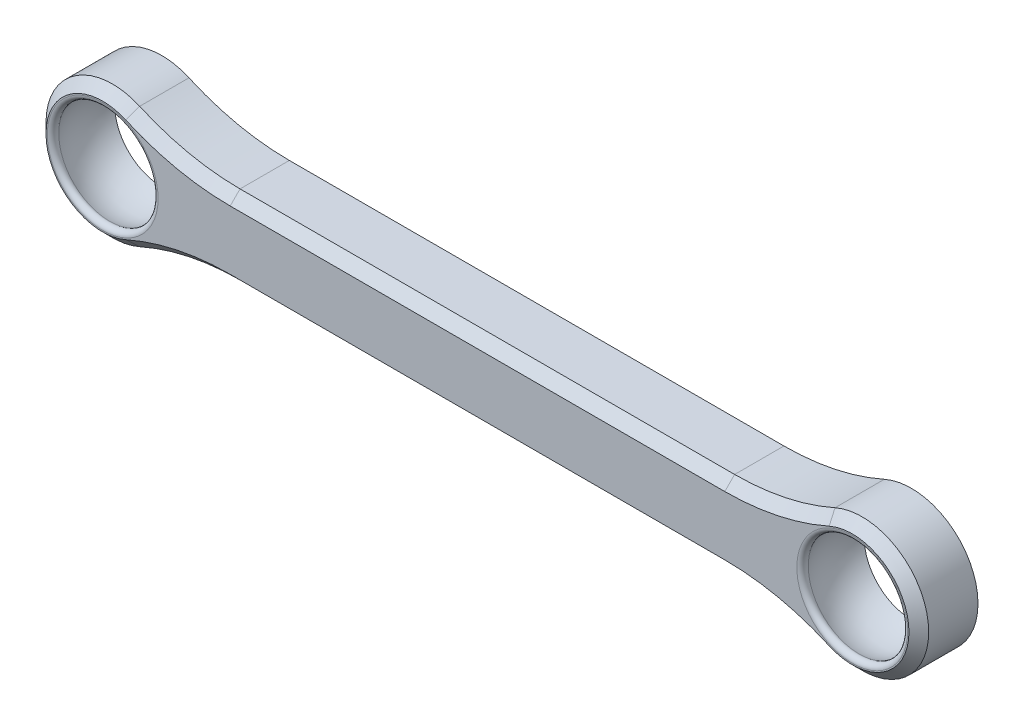
ISO-10303-21;
HEADER;
FILE_DESCRIPTION(('STEP AP214'),'2;1');
FILE_NAME('part.step','',(''),(''),'','','');
FILE_SCHEMA(('AUTOMOTIVE_DESIGN { 1 0 10303 214 1 1 1 1 }'));
ENDSEC;
DATA;
#1=APPLICATION_CONTEXT('core data for automotive mechanical design processes');
#2=APPLICATION_PROTOCOL_DEFINITION('international standard','automotive_design',2000,#1);
#3=PRODUCT_CONTEXT('',#1,'mechanical');
#4=PRODUCT('Part','Part','',(#3));
#5=PRODUCT_RELATED_PRODUCT_CATEGORY('part','',(#4));
#6=PRODUCT_DEFINITION_FORMATION('','',#4);
#7=PRODUCT_DEFINITION_CONTEXT('part definition',#1,'design');
#8=PRODUCT_DEFINITION('design','',#6,#7);
#9=PRODUCT_DEFINITION_SHAPE('','',#8);
#10=(LENGTH_UNIT() NAMED_UNIT(*) SI_UNIT(.MILLI.,.METRE.));
#11=(NAMED_UNIT(*) PLANE_ANGLE_UNIT() SI_UNIT($,.RADIAN.));
#12=(NAMED_UNIT(*) SI_UNIT($,.STERADIAN.) SOLID_ANGLE_UNIT());
#13=UNCERTAINTY_MEASURE_WITH_UNIT(LENGTH_MEASURE(1.E-05),#10,'distance_accuracy_value','');
#14=(GEOMETRIC_REPRESENTATION_CONTEXT(3) GLOBAL_UNCERTAINTY_ASSIGNED_CONTEXT((#13)) GLOBAL_UNIT_ASSIGNED_CONTEXT((#10,
#11,#12)) REPRESENTATION_CONTEXT('',''));
#15=CARTESIAN_POINT('',(0.,0.,0.));
#16=DIRECTION('',(0.,0.,1.));
#17=DIRECTION('',(1.,0.,0.));
#18=AXIS2_PLACEMENT_3D('',#15,#16,#17);
#19=CARTESIAN_POINT('',(8.,0.,6.));
#20=DIRECTION('',(0.,0.,-1.));
#21=DIRECTION('',(-1.,0.,0.));
#22=AXIS2_PLACEMENT_3D('',#19,#20,#21);
#23=CYLINDRICAL_SURFACE('',#22,6.75);
#24=DIRECTION('',(0.,0.,-1.));
#25=VECTOR('',#24,1.);
#26=CARTESIAN_POINT('',(10.7478911872219,-6.16535433070866,6.));
#27=LINE('',#26,#25);
#28=CARTESIAN_POINT('',(10.7478911872219,-6.16535433070866,0.));
#29=VERTEX_POINT('',#28);
#30=CARTESIAN_POINT('',(10.7478911872219,-6.16535433070866,5.00000000000001));
#31=VERTEX_POINT('',#30);
#32=EDGE_CURVE('E186',#29,#31,#27,.F.);
#33=ORIENTED_EDGE('',*,*,#32,.T.);
#34=CARTESIAN_POINT('',(8.,0.,5.00000000000001));
#35=DIRECTION('',(0.,0.,-1.));
#36=DIRECTION('',(-1.,0.,0.));
#37=AXIS2_PLACEMENT_3D('',#34,#35,#36);
#38=CIRCLE('',#37,6.75);
#39=CARTESIAN_POINT('',(10.7478911872219,6.16535433070866,5.00000000000001));
#40=VERTEX_POINT('',#39);
#41=EDGE_CURVE('E56',#31,#40,#38,.T.);
#42=ORIENTED_EDGE('',*,*,#41,.T.);
#43=DIRECTION('',(0.,0.,-1.));
#44=VECTOR('',#43,1.);
#45=CARTESIAN_POINT('',(10.7478911872219,6.16535433070866,6.));
#46=LINE('',#45,#44);
#47=CARTESIAN_POINT('',(10.7478911872219,6.16535433070866,0.));
#48=VERTEX_POINT('',#47);
#49=EDGE_CURVE('E183',#40,#48,#46,.T.);
#50=ORIENTED_EDGE('',*,*,#49,.T.);
#51=CARTESIAN_POINT('',(8.,0.,0.));
#52=DIRECTION('',(0.,0.,-1.));
#53=DIRECTION('',(-1.,0.,0.));
#54=AXIS2_PLACEMENT_3D('',#51,#52,#53);
#55=CIRCLE('',#54,6.75);
#56=EDGE_CURVE('E144',#29,#48,#55,.T.);
#57=ORIENTED_EDGE('',*,*,#56,.F.);
#58=EDGE_LOOP('',(#33,#42,#50,#57));
#59=FACE_BOUND('',#58,.T.);
#60=ADVANCED_FACE('F45',(#59),#23,.T.);
#61=CARTESIAN_POINT('',(78.5628592072671,-4.,6.));
#62=DIRECTION('',(0.,-1.,0.));
#63=DIRECTION('',(0.,0.,-1.));
#64=AXIS2_PLACEMENT_3D('',#61,#62,#63);
#65=PLANE('',#64);
#66=DIRECTION('',(0.,0.,1.));
#67=VECTOR('',#66,1.);
#68=CARTESIAN_POINT('',(71.0747340452894,-4.,6.));
#69=LINE('',#68,#67);
#70=CARTESIAN_POINT('',(71.0747340452894,-4.,0.));
#71=VERTEX_POINT('',#70);
#72=CARTESIAN_POINT('',(71.0747340452894,-4.,5.00000000000001));
#73=VERTEX_POINT('',#72);
#74=EDGE_CURVE('E176',#71,#73,#69,.T.);
#75=ORIENTED_EDGE('',*,*,#74,.T.);
#76=DIRECTION('',(-1.,0.,0.));
#77=VECTOR('',#76,1.);
#78=CARTESIAN_POINT('',(20.9252659547106,-4.,5.00000000000001));
#79=LINE('',#78,#77);
#80=CARTESIAN_POINT('',(20.9252659547106,-4.,5.00000000000001));
#81=VERTEX_POINT('',#80);
#82=EDGE_CURVE('E228',#73,#81,#79,.T.);
#83=ORIENTED_EDGE('',*,*,#82,.T.);
#84=DIRECTION('',(0.,0.,1.));
#85=VECTOR('',#84,1.);
#86=CARTESIAN_POINT('',(20.9252659547106,-4.,0.));
#87=LINE('',#86,#85);
#88=CARTESIAN_POINT('',(20.9252659547106,-4.,0.));
#89=VERTEX_POINT('',#88);
#90=EDGE_CURVE('E180',#81,#89,#87,.F.);
#91=ORIENTED_EDGE('',*,*,#90,.T.);
#92=DIRECTION('',(-1.,0.,0.));
#93=VECTOR('',#92,1.);
#94=CARTESIAN_POINT('',(78.5628592072671,-4.,0.));
#95=LINE('',#94,#93);
#96=EDGE_CURVE('E161',#71,#89,#95,.T.);
#97=ORIENTED_EDGE('',*,*,#96,.F.);
#98=EDGE_LOOP('',(#75,#83,#91,#97));
#99=FACE_BOUND('',#98,.T.);
#100=ADVANCED_FACE('F339',(#99),#65,.T.);
#101=CARTESIAN_POINT('',(84.,0.,6.));
#102=DIRECTION('',(0.,0.,-1.));
#103=DIRECTION('',(-1.,0.,0.));
#104=AXIS2_PLACEMENT_3D('',#101,#102,#103);
#105=CYLINDRICAL_SURFACE('',#104,6.75);
#106=DIRECTION('',(0.,0.,-1.));
#107=VECTOR('',#106,1.);
#108=CARTESIAN_POINT('',(81.2521088127781,6.16535433070866,6.));
#109=LINE('',#108,#107);
#110=CARTESIAN_POINT('',(81.2521088127781,6.16535433070866,0.));
#111=VERTEX_POINT('',#110);
#112=CARTESIAN_POINT('',(81.2521088127781,6.16535433070866,5.00000000000001));
#113=VERTEX_POINT('',#112);
#114=EDGE_CURVE('E172',#111,#113,#109,.F.);
#115=ORIENTED_EDGE('',*,*,#114,.T.);
#116=CARTESIAN_POINT('',(84.,0.,5.00000000000001));
#117=DIRECTION('',(0.,0.,-1.));
#118=DIRECTION('',(-1.,0.,0.));
#119=AXIS2_PLACEMENT_3D('',#116,#117,#118);
#120=CIRCLE('',#119,6.75);
#121=CARTESIAN_POINT('',(81.2521088127781,-6.16535433070866,5.00000000000001));
#122=VERTEX_POINT('',#121);
#123=EDGE_CURVE('E225',#113,#122,#120,.T.);
#124=ORIENTED_EDGE('',*,*,#123,.T.);
#125=DIRECTION('',(0.,0.,-1.));
#126=VECTOR('',#125,1.);
#127=CARTESIAN_POINT('',(81.2521088127781,-6.16535433070866,6.));
#128=LINE('',#127,#126);
#129=CARTESIAN_POINT('',(81.2521088127781,-6.16535433070866,0.));
#130=VERTEX_POINT('',#129);
#131=EDGE_CURVE('E165',#122,#130,#128,.T.);
#132=ORIENTED_EDGE('',*,*,#131,.T.);
#133=CARTESIAN_POINT('',(84.,0.,0.));
#134=DIRECTION('',(0.,0.,-1.));
#135=DIRECTION('',(-1.,0.,0.));
#136=AXIS2_PLACEMENT_3D('',#133,#134,#135);
#137=CIRCLE('',#136,6.75);
#138=EDGE_CURVE('E157',#111,#130,#137,.T.);
#139=ORIENTED_EDGE('',*,*,#138,.F.);
#140=EDGE_LOOP('',(#115,#124,#132,#139));
#141=FACE_BOUND('',#140,.T.);
#142=ADVANCED_FACE('F309',(#141),#105,.T.);
#143=CARTESIAN_POINT('',(13.4371407927329,4.,6.));
#144=DIRECTION('',(0.,1.,0.));
#145=DIRECTION('',(-1.,0.,0.));
#146=AXIS2_PLACEMENT_3D('',#143,#144,#145);
#147=PLANE('',#146);
#148=DIRECTION('',(0.,0.,1.));
#149=VECTOR('',#148,1.);
#150=CARTESIAN_POINT('',(20.9252659547106,4.,6.));
#151=LINE('',#150,#149);
#152=CARTESIAN_POINT('',(20.9252659547106,4.,0.));
#153=VERTEX_POINT('',#152);
#154=CARTESIAN_POINT('',(20.9252659547106,4.,5.00000000000001));
#155=VERTEX_POINT('',#154);
#156=EDGE_CURVE('E151',#153,#155,#151,.T.);
#157=ORIENTED_EDGE('',*,*,#156,.T.);
#158=DIRECTION('',(1.,0.,0.));
#159=VECTOR('',#158,1.);
#160=CARTESIAN_POINT('',(71.0747340452894,4.,5.00000000000001));
#161=LINE('',#160,#159);
#162=CARTESIAN_POINT('',(71.0747340452894,4.,5.00000000000001));
#163=VERTEX_POINT('',#162);
#164=EDGE_CURVE('E237',#155,#163,#161,.T.);
#165=ORIENTED_EDGE('',*,*,#164,.T.);
#166=DIRECTION('',(0.,0.,1.));
#167=VECTOR('',#166,1.);
#168=CARTESIAN_POINT('',(71.0747340452894,4.,0.));
#169=LINE('',#168,#167);
#170=CARTESIAN_POINT('',(71.0747340452894,4.,0.));
#171=VERTEX_POINT('',#170);
#172=EDGE_CURVE('E154',#163,#171,#169,.F.);
#173=ORIENTED_EDGE('',*,*,#172,.T.);
#174=DIRECTION('',(1.,0.,0.));
#175=VECTOR('',#174,1.);
#176=CARTESIAN_POINT('',(13.4371407927329,4.,0.));
#177=LINE('',#176,#175);
#178=EDGE_CURVE('E142',#153,#171,#177,.T.);
#179=ORIENTED_EDGE('',*,*,#178,.F.);
#180=EDGE_LOOP('',(#157,#165,#173,#179));
#181=FACE_BOUND('',#180,.T.);
#182=ADVANCED_FACE('F150',(#181),#147,.T.);
#183=CARTESIAN_POINT('',(8.,0.,6.));
#184=DIRECTION('',(0.,0.,-1.));
#185=DIRECTION('',(-1.,0.,0.));
#186=AXIS2_PLACEMENT_3D('',#183,#184,#185);
#187=PLANE('',#186);
#188=DIRECTION('',(1.,0.,0.));
#189=VECTOR('',#188,1.);
#190=CARTESIAN_POINT('',(71.0747340452894,-3.00000000000001,6.));
#191=LINE('',#190,#189);
#192=CARTESIAN_POINT('',(20.9252659547106,-3.00000000000001,6.));
#193=VERTEX_POINT('',#192);
#194=CARTESIAN_POINT('',(71.0747340452894,-3.00000000000001,6.));
#195=VERTEX_POINT('',#194);
#196=EDGE_CURVE('E211',#193,#195,#191,.T.);
#197=ORIENTED_EDGE('',*,*,#196,.T.);
#198=CARTESIAN_POINT('',(71.0747340452894,-29.,6.));
#199=DIRECTION('',(0.,0.,-1.));
#200=DIRECTION('',(-1.,0.,0.));
#201=AXIS2_PLACEMENT_3D('',#198,#199,#200);
#202=CIRCLE('',#201,26.);
#203=CARTESIAN_POINT('',(81.6592038034776,-5.25196850393701,6.));
#204=VERTEX_POINT('',#203);
#205=EDGE_CURVE('E217',#195,#204,#202,.T.);
#206=ORIENTED_EDGE('',*,*,#205,.T.);
#207=CARTESIAN_POINT('',(84.,0.,6.));
#208=DIRECTION('',(0.,0.,-1.));
#209=DIRECTION('',(-1.,0.,0.));
#210=AXIS2_PLACEMENT_3D('',#207,#208,#209);
#211=CIRCLE('',#210,5.75);
#212=CARTESIAN_POINT('',(81.6592038034776,5.25196850393701,6.));
#213=VERTEX_POINT('',#212);
#214=EDGE_CURVE('E214',#204,#213,#211,.F.);
#215=ORIENTED_EDGE('',*,*,#214,.T.);
#216=CARTESIAN_POINT('',(71.0747340452894,29.,6.));
#217=DIRECTION('',(0.,0.,-1.));
#218=DIRECTION('',(-1.,0.,0.));
#219=AXIS2_PLACEMENT_3D('',#216,#217,#218);
#220=CIRCLE('',#219,26.);
#221=CARTESIAN_POINT('',(71.0747340452894,3.00000000000001,6.));
#222=VERTEX_POINT('',#221);
#223=EDGE_CURVE('E208',#213,#222,#220,.T.);
#224=ORIENTED_EDGE('',*,*,#223,.T.);
#225=DIRECTION('',(-1.,0.,0.));
#226=VECTOR('',#225,1.);
#227=CARTESIAN_POINT('',(20.9252659547106,3.,6.));
#228=LINE('',#227,#226);
#229=CARTESIAN_POINT('',(20.9252659547106,3.,6.));
#230=VERTEX_POINT('',#229);
#231=EDGE_CURVE('E202',#222,#230,#228,.T.);
#232=ORIENTED_EDGE('',*,*,#231,.T.);
#233=CARTESIAN_POINT('',(20.9252659547106,29.,6.));
#234=DIRECTION('',(0.,0.,-1.));
#235=DIRECTION('',(-1.,0.,0.));
#236=AXIS2_PLACEMENT_3D('',#233,#234,#235);
#237=CIRCLE('',#236,26.);
#238=CARTESIAN_POINT('',(10.3407961965224,5.25196850393701,6.));
#239=VERTEX_POINT('',#238);
#240=EDGE_CURVE('E146',#230,#239,#237,.T.);
#241=ORIENTED_EDGE('',*,*,#240,.T.);
#242=CARTESIAN_POINT('',(8.,0.,6.));
#243=DIRECTION('',(0.,0.,-1.));
#244=DIRECTION('',(-1.,0.,0.));
#245=AXIS2_PLACEMENT_3D('',#242,#243,#244);
#246=CIRCLE('',#245,5.75000000000001);
#247=CARTESIAN_POINT('',(10.3407961965224,-5.25196850393701,6.));
#248=VERTEX_POINT('',#247);
#249=EDGE_CURVE('E199',#239,#248,#246,.F.);
#250=ORIENTED_EDGE('',*,*,#249,.T.);
#251=CARTESIAN_POINT('',(20.9252659547106,-29.,6.));
#252=DIRECTION('',(0.,0.,-1.));
#253=DIRECTION('',(-1.,0.,0.));
#254=AXIS2_PLACEMENT_3D('',#251,#252,#253);
#255=CIRCLE('',#254,26.);
#256=EDGE_CURVE('E205',#248,#193,#255,.T.);
#257=ORIENTED_EDGE('',*,*,#256,.T.);
#258=EDGE_LOOP('',(#197,#206,#215,#224,#232,#241,#250,#257));
#259=FACE_BOUND('',#258,.T.);
#260=CARTESIAN_POINT('',(8.,0.,6.));
#261=DIRECTION('',(0.,0.,1.));
#262=DIRECTION('',(1.,0.,0.));
#263=AXIS2_PLACEMENT_3D('',#260,#261,#262);
#264=CIRCLE('',#263,5.61894118139708);
#265=CARTESIAN_POINT('',(13.6189411813971,0.,6.));
#266=VERTEX_POINT('',#265);
#267=EDGE_CURVE('E283',#266,#266,#264,.T.);
#268=ORIENTED_EDGE('',*,*,#267,.F.);
#269=EDGE_LOOP('',(#268));
#270=FACE_BOUND('',#269,.T.);
#271=CARTESIAN_POINT('',(84.,0.,6.00000000000001));
#272=DIRECTION('',(0.,0.,1.));
#273=DIRECTION('',(1.,0.,0.));
#274=AXIS2_PLACEMENT_3D('',#271,#272,#273);
#275=CIRCLE('',#274,5.61894118139707);
#276=CARTESIAN_POINT('',(89.6189411813971,0.,6.));
#277=VERTEX_POINT('',#276);
#278=EDGE_CURVE('E297',#277,#277,#275,.T.);
#279=ORIENTED_EDGE('',*,*,#278,.F.);
#280=EDGE_LOOP('',(#279));
#281=FACE_BOUND('',#280,.T.);
#282=ADVANCED_FACE('F351',(#259,#270,#281),#187,.F.);
#283=CARTESIAN_POINT('',(8.,0.,0.));
#284=DIRECTION('',(0.,0.,-1.));
#285=DIRECTION('',(-1.,0.,0.));
#286=AXIS2_PLACEMENT_3D('',#283,#284,#285);
#287=PLANE('',#286);
#288=CARTESIAN_POINT('',(8.,0.,0.));
#289=DIRECTION('',(0.,0.,1.));
#290=DIRECTION('',(1.,0.,0.));
#291=AXIS2_PLACEMENT_3D('',#288,#289,#290);
#292=CIRCLE('',#291,4.78774477181063);
#293=CARTESIAN_POINT('',(12.7877447718106,0.,0.));
#294=VERTEX_POINT('',#293);
#295=EDGE_CURVE('E277',#294,#294,#292,.T.);
#296=ORIENTED_EDGE('',*,*,#295,.T.);
#297=EDGE_LOOP('',(#296));
#298=FACE_BOUND('',#297,.T.);
#299=CARTESIAN_POINT('',(84.,0.,0.));
#300=DIRECTION('',(0.,0.,1.));
#301=DIRECTION('',(1.,0.,0.));
#302=AXIS2_PLACEMENT_3D('',#299,#300,#301);
#303=CIRCLE('',#302,4.78774477181063);
#304=CARTESIAN_POINT('',(88.7877447718106,0.,0.));
#305=VERTEX_POINT('',#304);
#306=EDGE_CURVE('E293',#305,#305,#303,.T.);
#307=ORIENTED_EDGE('',*,*,#306,.T.);
#308=EDGE_LOOP('',(#307));
#309=FACE_BOUND('',#308,.T.);
#310=ORIENTED_EDGE('',*,*,#96,.T.);
#311=CARTESIAN_POINT('',(20.9252659547106,-29.,0.));
#312=DIRECTION('',(0.,0.,-1.));
#313=DIRECTION('',(-1.,0.,0.));
#314=AXIS2_PLACEMENT_3D('',#311,#312,#313);
#315=CIRCLE('',#314,25.);
#316=EDGE_CURVE('E192',#89,#29,#315,.F.);
#317=ORIENTED_EDGE('',*,*,#316,.T.);
#318=ORIENTED_EDGE('',*,*,#56,.T.);
#319=CARTESIAN_POINT('',(20.9252659547106,29.,0.));
#320=DIRECTION('',(0.,0.,-1.));
#321=DIRECTION('',(-1.,0.,0.));
#322=AXIS2_PLACEMENT_3D('',#319,#320,#321);
#323=CIRCLE('',#322,25.);
#324=EDGE_CURVE('E138',#48,#153,#323,.F.);
#325=ORIENTED_EDGE('',*,*,#324,.T.);
#326=ORIENTED_EDGE('',*,*,#178,.T.);
#327=CARTESIAN_POINT('',(71.0747340452894,29.,0.));
#328=DIRECTION('',(0.,0.,-1.));
#329=DIRECTION('',(-1.,0.,0.));
#330=AXIS2_PLACEMENT_3D('',#327,#328,#329);
#331=CIRCLE('',#330,25.);
#332=EDGE_CURVE('E189',#171,#111,#331,.F.);
#333=ORIENTED_EDGE('',*,*,#332,.T.);
#334=ORIENTED_EDGE('',*,*,#138,.T.);
#335=CARTESIAN_POINT('',(71.0747340452894,-29.,0.));
#336=DIRECTION('',(0.,0.,-1.));
#337=DIRECTION('',(-1.,0.,0.));
#338=AXIS2_PLACEMENT_3D('',#335,#336,#337);
#339=CIRCLE('',#338,25.);
#340=EDGE_CURVE('E147',#130,#71,#339,.F.);
#341=ORIENTED_EDGE('',*,*,#340,.T.);
#342=EDGE_LOOP('',(#310,#317,#318,#325,#326,#333,#334,#341));
#343=FACE_BOUND('',#342,.T.);
#344=ADVANCED_FACE('F141',(#298,#309,#343),#287,.T.);
#345=CARTESIAN_POINT('',(84.,0.,5.50000000000001));
#346=DIRECTION('',(0.,0.,1.));
#347=DIRECTION('',(1.,0.,0.));
#348=AXIS2_PLACEMENT_3D('',#345,#346,#347);
#349=TOROIDAL_SURFACE('',#348,5.61894118139707,0.500000000000001);
#350=CARTESIAN_POINT('',(84.,0.,5.29674796747968));
#351=DIRECTION('',(0.,0.,1.));
#352=DIRECTION('',(1.,0.,0.));
#353=AXIS2_PLACEMENT_3D('',#350,#351,#352);
#354=CIRCLE('',#353,5.16211669510462);
#355=CARTESIAN_POINT('',(89.1621166951046,0.,5.29674796747967));
#356=VERTEX_POINT('',#355);
#357=EDGE_CURVE('E289',#356,#356,#354,.T.);
#358=ORIENTED_EDGE('',*,*,#357,.F.);
#359=EDGE_LOOP('',(#358));
#360=FACE_BOUND('',#359,.T.);
#361=ORIENTED_EDGE('',*,*,#278,.T.);
#362=EDGE_LOOP('',(#361));
#363=FACE_BOUND('',#362,.T.);
#364=ADVANCED_FACE('F531',(#360,#363),#349,.T.);
#365=CARTESIAN_POINT('',(84.,0.,3.));
#366=DIRECTION('',(0.,0.,1.));
#367=DIRECTION('',(1.,0.,0.));
#368=AXIS2_PLACEMENT_3D('',#365,#366,#367);
#369=SPHERICAL_SURFACE('',#368,5.65);
#370=CARTESIAN_POINT('',(88.7877447718106,0.,0.));
#371=CARTESIAN_POINT('',(88.8183191944076,0.,0.0487936210561455));
#372=CARTESIAN_POINT('',(88.8481472026277,0.,0.098054926761022));
#373=CARTESIAN_POINT('',(88.9062836300792,0.,0.197466207475918));
#374=CARTESIAN_POINT('',(88.9345920493107,0.,0.247616182485938));
#375=CARTESIAN_POINT('',(88.9896625385502,0.,0.348758101818808));
#376=CARTESIAN_POINT('',(89.0164246085583,0.,0.399750046141658));
#377=CARTESIAN_POINT('',(89.0683774650869,0.,0.502528194542589));
#378=CARTESIAN_POINT('',(89.0935682516074,0.,0.55431439862067));
#379=CARTESIAN_POINT('',(89.1423549736078,0.,0.658632674212033));
#380=CARTESIAN_POINT('',(89.1659509090878,0.,0.711164745725316));
#381=CARTESIAN_POINT('',(89.2115258794978,0.,0.816925650719742));
#382=CARTESIAN_POINT('',(89.2335049144278,0.,0.870154484200885));
#383=CARTESIAN_POINT('',(89.2758255382346,0.,0.977259160677256));
#384=CARTESIAN_POINT('',(89.2961671271114,0.,1.03113500367248));
#385=CARTESIAN_POINT('',(89.3351938458026,0.,1.13948334081168));
#386=CARTESIAN_POINT('',(89.3538789756171,0.,1.19395583495565));
#387=CARTESIAN_POINT('',(89.3895753109526,0.,1.30344655864045));
#388=CARTESIAN_POINT('',(89.4065865164737,0.,1.35846478818128));
#389=CARTESIAN_POINT('',(89.4389191027607,0.,1.4689955567229));
#390=CARTESIAN_POINT('',(89.4542404835267,0.,1.52450809572369));
#391=CARTESIAN_POINT('',(89.4831790992951,0.,1.63597559523593));
#392=CARTESIAN_POINT('',(89.4967963342975,0.,1.69193055574739));
#393=CARTESIAN_POINT('',(89.5223139304173,0.,1.8042305967913));
#394=CARTESIAN_POINT('',(89.5342142915346,0.,1.86057567732376));
#395=CARTESIAN_POINT('',(89.5562870165338,0.,1.97360329227374));
#396=CARTESIAN_POINT('',(89.5664593804156,0.,2.03028582669125));
#397=CARTESIAN_POINT('',(89.5850666027651,0.,2.14393536785449));
#398=CARTESIAN_POINT('',(89.5935014612327,0.,2.2009023746002));
#399=CARTESIAN_POINT('',(89.6086257886333,0.,2.31506761296484));
#400=CARTESIAN_POINT('',(89.6153152575663,0.,2.37226584458376));
#401=CARTESIAN_POINT('',(89.6269425532045,0.,2.48684006911229));
#402=CARTESIAN_POINT('',(89.6318803799099,0.,2.54421606202191));
#403=CARTESIAN_POINT('',(89.6399997756722,0.,2.65909217939462));
#404=CARTESIAN_POINT('',(89.6431813447292,0.,2.71659230385772));
#405=CARTESIAN_POINT('',(89.6477852513603,0.,2.83166293857356));
#406=CARTESIAN_POINT('',(89.6492075889344,0.,2.88923344882631));
#407=CARTESIAN_POINT('',(89.6502917031308,0.,3.00439104356753));
#408=CARTESIAN_POINT('',(89.6499534797532,0.,3.061978128056));
#409=CARTESIAN_POINT('',(89.647516788186,0.,3.17711504422272));
#410=CARTESIAN_POINT('',(89.6454183199964,0.,3.23466487590097));
#411=CARTESIAN_POINT('',(89.639463100258,0.,3.34967349422167));
#412=CARTESIAN_POINT('',(89.635606348709,0.,3.40713228086411));
#413=CARTESIAN_POINT('',(89.6261381671847,0.,3.52190510198836));
#414=CARTESIAN_POINT('',(89.6205267372094,0.,3.57921913647016));
#415=CARTESIAN_POINT('',(89.6075544438723,0.,3.69364888144795));
#416=CARTESIAN_POINT('',(89.6001935805107,0.,3.75076459194394));
#417=CARTESIAN_POINT('',(89.5837293006594,0.,3.86474430250415));
#418=CARTESIAN_POINT('',(89.5746258841698,0.,3.92160830256837));
#419=CARTESIAN_POINT('',(89.5546850070572,0.,4.03503144107804));
#420=CARTESIAN_POINT('',(89.5438475464341,0.,4.09159057952349));
#421=CARTESIAN_POINT('',(89.5204487110229,0.,4.20435112862662));
#422=CARTESIAN_POINT('',(89.5078873362348,0.,4.26055253928429));
#423=CARTESIAN_POINT('',(89.4810524132529,0.,4.37254510078307));
#424=CARTESIAN_POINT('',(89.4667788650591,0.,4.42833625162418));
#425=CARTESIAN_POINT('',(89.4365329385091,0.,4.53945614579368));
#426=CARTESIAN_POINT('',(89.4205605601528,0.,4.59478488912207));
#427=CARTESIAN_POINT('',(89.3869318965784,0.,4.70492824957609));
#428=CARTESIAN_POINT('',(89.3692756113602,0.,4.75974286670172));
#429=CARTESIAN_POINT('',(89.3322956606227,0.,4.86880674859509));
#430=CARTESIAN_POINT('',(89.3129719951033,0.,4.92305601336282));
#431=CARTESIAN_POINT('',(89.2726752594834,0.,5.03093844812309));
#432=CARTESIAN_POINT('',(89.2517021893829,0.,5.08457161811562));
#433=CARTESIAN_POINT('',(89.2081265701402,0.,5.19117186360228));
#434=CARTESIAN_POINT('',(89.185524020998,0.,5.24413893909639));
#435=CARTESIAN_POINT('',(89.1621166951046,0.,5.29674796747967));
#436=B_SPLINE_CURVE_WITH_KNOTS('',3,(#370,#371,#372,#373,#374,#375,#376,#377,#378,#379,#380,
#381,#382,#383,#384,#385,#386,#387,#388,#389,#390,#391,#392,#393,#394,#395,#396,#397,#398,#399,
#400,#401,#402,#403,#404,#405,#406,#407,#408,#409,#410,#411,#412,#413,#414,#415,#416,#417,#418,
#419,#420,#421,#422,#423,#424,#425,#426,#427,#428,#429,#430,#431,#432,#433,#434,#435),
.UNSPECIFIED.,.F.,.F.,(4,2,2,2,2,2,2,2,2,2,2,2,2,2,2,2,2,2,2,2,2,2,2,2,2,2,2,2,2,2,2,2,4),(0.,
0.17273731915854,0.345474638317075,0.518211957475612,0.690949276634151,0.863686595792688,
1.03642391495123,1.20916123410976,1.3818985532683,1.55463587242683,1.72737319158537,
1.90011051074391,2.07284782990245,2.24558514906099,2.41832246821952,2.59105978737806,
2.7637971065366,2.93653442569514,3.10927174485367,3.28200906401221,3.45474638317075,
3.62748370232929,3.80022102148782,3.97295834064636,4.1456956598049,4.31843297896343,
4.49117029812197,4.66390761728051,4.83664493643905,5.00938225559759,5.18211957475612,
5.35485689391466,5.5275942130732),.UNSPECIFIED.);
#437=EDGE_CURVE('BSEAM520',#305,#356,#436,.T.);
#438=ORIENTED_EDGE('',*,*,#306,.F.);
#439=ORIENTED_EDGE('',*,*,#357,.T.);
#440=ORIENTED_EDGE('',*,*,#437,.T.);
#441=ORIENTED_EDGE('',*,*,#437,.F.);
#442=EDGE_LOOP('',(#438,#440,#439,#441));
#443=FACE_BOUND('',#442,.T.);
#444=ADVANCED_FACE('F520',(#443),#369,.F.);
#445=CARTESIAN_POINT('',(8.,0.,5.5));
#446=DIRECTION('',(0.,0.,1.));
#447=DIRECTION('',(1.,0.,0.));
#448=AXIS2_PLACEMENT_3D('',#445,#446,#447);
#449=TOROIDAL_SURFACE('',#448,5.61894118139708,0.500000000000003);
#450=CARTESIAN_POINT('',(8.,0.,5.29674796747967));
#451=DIRECTION('',(0.,0.,1.));
#452=DIRECTION('',(1.,0.,0.));
#453=AXIS2_PLACEMENT_3D('',#450,#451,#452);
#454=CIRCLE('',#453,5.16211669510463);
#455=CARTESIAN_POINT('',(13.1621166951046,0.,5.29674796747967));
#456=VERTEX_POINT('',#455);
#457=EDGE_CURVE('E271',#456,#456,#454,.T.);
#458=ORIENTED_EDGE('',*,*,#457,.F.);
#459=EDGE_LOOP('',(#458));
#460=FACE_BOUND('',#459,.T.);
#461=ORIENTED_EDGE('',*,*,#267,.T.);
#462=EDGE_LOOP('',(#461));
#463=FACE_BOUND('',#462,.T.);
#464=ADVANCED_FACE('F508',(#460,#463),#449,.T.);
#465=CARTESIAN_POINT('',(8.,0.,3.));
#466=DIRECTION('',(0.,0.,1.));
#467=DIRECTION('',(1.,0.,0.));
#468=AXIS2_PLACEMENT_3D('',#465,#466,#467);
#469=SPHERICAL_SURFACE('',#468,5.65);
#470=CARTESIAN_POINT('',(12.7877447718106,0.,0.));
#471=CARTESIAN_POINT('',(12.8183191944076,0.,0.0487936210561476));
#472=CARTESIAN_POINT('',(12.8481472026277,0.,0.0980549267610235));
#473=CARTESIAN_POINT('',(12.9062836300792,0.,0.197466207475919));
#474=CARTESIAN_POINT('',(12.9345920493106,0.,0.247616182485939));
#475=CARTESIAN_POINT('',(12.9896625385502,0.,0.348758101818808));
#476=CARTESIAN_POINT('',(13.0164246085583,0.,0.399750046141658));
#477=CARTESIAN_POINT('',(13.0683774650869,0.,0.502528194542589));
#478=CARTESIAN_POINT('',(13.0935682516073,0.,0.554314398620671));
#479=CARTESIAN_POINT('',(13.1423549736078,0.,0.658632674212035));
#480=CARTESIAN_POINT('',(13.1659509090878,0.,0.711164745725317));
#481=CARTESIAN_POINT('',(13.2115258794978,0.,0.816925650719743));
#482=CARTESIAN_POINT('',(13.2335049144278,0.,0.870154484200886));
#483=CARTESIAN_POINT('',(13.2758255382346,0.,0.977259160677258));
#484=CARTESIAN_POINT('',(13.2961671271114,0.,1.03113500367249));
#485=CARTESIAN_POINT('',(13.3351938458026,0.,1.13948334081168));
#486=CARTESIAN_POINT('',(13.3538789756171,0.,1.19395583495565));
#487=CARTESIAN_POINT('',(13.3895753109526,0.,1.30344655864045));
#488=CARTESIAN_POINT('',(13.4065865164737,0.,1.35846478818128));
#489=CARTESIAN_POINT('',(13.4389191027607,0.,1.4689955567229));
#490=CARTESIAN_POINT('',(13.4542404835267,0.,1.52450809572369));
#491=CARTESIAN_POINT('',(13.4831790992951,0.,1.63597559523593));
#492=CARTESIAN_POINT('',(13.4967963342975,0.,1.69193055574739));
#493=CARTESIAN_POINT('',(13.5223139304173,0.,1.8042305967913));
#494=CARTESIAN_POINT('',(13.5342142915346,0.,1.86057567732376));
#495=CARTESIAN_POINT('',(13.5562870165338,0.,1.97360329227374));
#496=CARTESIAN_POINT('',(13.5664593804156,0.,2.03028582669125));
#497=CARTESIAN_POINT('',(13.5850666027651,0.,2.14393536785449));
#498=CARTESIAN_POINT('',(13.5935014612327,0.,2.2009023746002));
#499=CARTESIAN_POINT('',(13.6086257886333,0.,2.31506761296484));
#500=CARTESIAN_POINT('',(13.6153152575663,0.,2.37226584458376));
#501=CARTESIAN_POINT('',(13.6269425532045,0.,2.48684006911229));
#502=CARTESIAN_POINT('',(13.6318803799099,0.,2.54421606202191));
#503=CARTESIAN_POINT('',(13.6399997756722,0.,2.65909217939462));
#504=CARTESIAN_POINT('',(13.6431813447292,0.,2.71659230385772));
#505=CARTESIAN_POINT('',(13.6477852513603,0.,2.83166293857356));
#506=CARTESIAN_POINT('',(13.6492075889344,0.,2.88923344882631));
#507=CARTESIAN_POINT('',(13.6502917031308,0.,3.00439104356753));
#508=CARTESIAN_POINT('',(13.6499534797532,0.,3.061978128056));
#509=CARTESIAN_POINT('',(13.647516788186,0.,3.17711504422272));
#510=CARTESIAN_POINT('',(13.6454183199964,0.,3.23466487590097));
#511=CARTESIAN_POINT('',(13.6394631002579,0.,3.34967349422167));
#512=CARTESIAN_POINT('',(13.635606348709,0.,3.40713228086411));
#513=CARTESIAN_POINT('',(13.6261381671847,0.,3.52190510198836));
#514=CARTESIAN_POINT('',(13.6205267372094,0.,3.57921913647016));
#515=CARTESIAN_POINT('',(13.6075544438723,0.,3.69364888144795));
#516=CARTESIAN_POINT('',(13.6001935805107,0.,3.75076459194394));
#517=CARTESIAN_POINT('',(13.5837293006594,0.,3.86474430250415));
#518=CARTESIAN_POINT('',(13.5746258841698,0.,3.92160830256837));
#519=CARTESIAN_POINT('',(13.5546850070572,0.,4.03503144107804));
#520=CARTESIAN_POINT('',(13.5438475464341,0.,4.09159057952349));
#521=CARTESIAN_POINT('',(13.5204487110229,0.,4.20435112862662));
#522=CARTESIAN_POINT('',(13.5078873362348,0.,4.26055253928429));
#523=CARTESIAN_POINT('',(13.4810524132529,0.,4.37254510078307));
#524=CARTESIAN_POINT('',(13.4667788650591,0.,4.42833625162418));
#525=CARTESIAN_POINT('',(13.4365329385091,0.,4.53945614579368));
#526=CARTESIAN_POINT('',(13.4205605601528,0.,4.59478488912207));
#527=CARTESIAN_POINT('',(13.3869318965784,0.,4.70492824957609));
#528=CARTESIAN_POINT('',(13.3692756113602,0.,4.75974286670172));
#529=CARTESIAN_POINT('',(13.3322956606227,0.,4.86880674859509));
#530=CARTESIAN_POINT('',(13.3129719951033,0.,4.92305601336282));
#531=CARTESIAN_POINT('',(13.2726752594834,0.,5.03093844812309));
#532=CARTESIAN_POINT('',(13.2517021893829,0.,5.08457161811562));
#533=CARTESIAN_POINT('',(13.2081265701402,0.,5.19117186360228));
#534=CARTESIAN_POINT('',(13.185524020998,0.,5.24413893909639));
#535=CARTESIAN_POINT('',(13.1621166951046,0.,5.29674796747967));
#536=B_SPLINE_CURVE_WITH_KNOTS('',3,(#470,#471,#472,#473,#474,#475,#476,#477,#478,#479,#480,
#481,#482,#483,#484,#485,#486,#487,#488,#489,#490,#491,#492,#493,#494,#495,#496,#497,#498,#499,
#500,#501,#502,#503,#504,#505,#506,#507,#508,#509,#510,#511,#512,#513,#514,#515,#516,#517,#518,
#519,#520,#521,#522,#523,#524,#525,#526,#527,#528,#529,#530,#531,#532,#533,#534,#535),
.UNSPECIFIED.,.F.,.F.,(4,2,2,2,2,2,2,2,2,2,2,2,2,2,2,2,2,2,2,2,2,2,2,2,2,2,2,2,2,2,2,2,4),(0.,
0.172737319158538,0.345474638317074,0.518211957475611,0.690949276634149,0.863686595792686,
1.03642391495122,1.20916123410976,1.3818985532683,1.55463587242684,1.72737319158537,
1.90011051074391,2.07284782990245,2.24558514906098,2.41832246821952,2.59105978737806,
2.7637971065366,2.93653442569513,3.10927174485367,3.28200906401221,3.45474638317075,
3.62748370232928,3.80022102148782,3.97295834064636,4.14569565980489,4.31843297896343,
4.49117029812197,4.66390761728051,4.83664493643904,5.00938225559758,5.18211957475612,
5.35485689391466,5.52759421307319),.UNSPECIFIED.);
#537=EDGE_CURVE('BSEAM375',#294,#456,#536,.T.);
#538=ORIENTED_EDGE('',*,*,#295,.F.);
#539=ORIENTED_EDGE('',*,*,#457,.T.);
#540=ORIENTED_EDGE('',*,*,#537,.T.);
#541=ORIENTED_EDGE('',*,*,#537,.F.);
#542=EDGE_LOOP('',(#538,#540,#539,#541));
#543=FACE_BOUND('',#542,.T.);
#544=ADVANCED_FACE('F375',(#543),#469,.F.);
#545=CARTESIAN_POINT('',(71.0747340452894,29.,6.));
#546=DIRECTION('',(0.,0.,-1.));
#547=DIRECTION('',(-1.,0.,0.));
#548=AXIS2_PLACEMENT_3D('',#545,#546,#547);
#549=CYLINDRICAL_SURFACE('',#548,25.);
#550=ORIENTED_EDGE('',*,*,#172,.F.);
#551=CARTESIAN_POINT('',(71.0747340452894,29.,5.00000000000001));
#552=DIRECTION('',(0.,0.,-1.));
#553=DIRECTION('',(-1.,0.,0.));
#554=AXIS2_PLACEMENT_3D('',#551,#552,#553);
#555=CIRCLE('',#554,25.);
#556=EDGE_CURVE('E231',#163,#113,#555,.F.);
#557=ORIENTED_EDGE('',*,*,#556,.T.);
#558=ORIENTED_EDGE('',*,*,#114,.F.);
#559=ORIENTED_EDGE('',*,*,#332,.F.);
#560=EDGE_LOOP('',(#550,#557,#558,#559));
#561=FACE_BOUND('',#560,.T.);
#562=ADVANCED_FACE('F313',(#561),#549,.F.);
#563=CARTESIAN_POINT('',(20.9252659547106,-29.,6.));
#564=DIRECTION('',(0.,0.,-1.));
#565=DIRECTION('',(-1.,0.,0.));
#566=AXIS2_PLACEMENT_3D('',#563,#564,#565);
#567=CYLINDRICAL_SURFACE('',#566,25.);
#568=ORIENTED_EDGE('',*,*,#90,.F.);
#569=CARTESIAN_POINT('',(20.9252659547106,-29.,5.00000000000001));
#570=DIRECTION('',(0.,0.,-1.));
#571=DIRECTION('',(-1.,0.,0.));
#572=AXIS2_PLACEMENT_3D('',#569,#570,#571);
#573=CIRCLE('',#572,25.);
#574=EDGE_CURVE('E234',#81,#31,#573,.F.);
#575=ORIENTED_EDGE('',*,*,#574,.T.);
#576=ORIENTED_EDGE('',*,*,#32,.F.);
#577=ORIENTED_EDGE('',*,*,#316,.F.);
#578=EDGE_LOOP('',(#568,#575,#576,#577));
#579=FACE_BOUND('',#578,.T.);
#580=ADVANCED_FACE('F343',(#579),#567,.F.);
#581=CARTESIAN_POINT('',(71.0747340452894,-29.,6.));
#582=DIRECTION('',(0.,0.,-1.));
#583=DIRECTION('',(-1.,0.,0.));
#584=AXIS2_PLACEMENT_3D('',#581,#582,#583);
#585=CYLINDRICAL_SURFACE('',#584,25.);
#586=ORIENTED_EDGE('',*,*,#131,.F.);
#587=CARTESIAN_POINT('',(71.0747340452894,-29.,5.00000000000001));
#588=DIRECTION('',(0.,0.,-1.));
#589=DIRECTION('',(-1.,0.,0.));
#590=AXIS2_PLACEMENT_3D('',#587,#588,#589);
#591=CIRCLE('',#590,25.);
#592=EDGE_CURVE('E221',#122,#73,#591,.F.);
#593=ORIENTED_EDGE('',*,*,#592,.T.);
#594=ORIENTED_EDGE('',*,*,#74,.F.);
#595=ORIENTED_EDGE('',*,*,#340,.F.);
#596=EDGE_LOOP('',(#586,#593,#594,#595));
#597=FACE_BOUND('',#596,.T.);
#598=ADVANCED_FACE('F326',(#597),#585,.F.);
#599=CARTESIAN_POINT('',(20.9252659547106,29.,6.));
#600=DIRECTION('',(0.,0.,-1.));
#601=DIRECTION('',(-1.,0.,0.));
#602=AXIS2_PLACEMENT_3D('',#599,#600,#601);
#603=CYLINDRICAL_SURFACE('',#602,25.);
#604=ORIENTED_EDGE('',*,*,#49,.F.);
#605=CARTESIAN_POINT('',(20.9252659547106,29.,5.00000000000001));
#606=DIRECTION('',(0.,0.,-1.));
#607=DIRECTION('',(-1.,0.,0.));
#608=AXIS2_PLACEMENT_3D('',#605,#606,#607);
#609=CIRCLE('',#608,25.);
#610=EDGE_CURVE('E11',#40,#155,#609,.F.);
#611=ORIENTED_EDGE('',*,*,#610,.T.);
#612=ORIENTED_EDGE('',*,*,#156,.F.);
#613=ORIENTED_EDGE('',*,*,#324,.F.);
#614=EDGE_LOOP('',(#604,#611,#612,#613));
#615=FACE_BOUND('',#614,.T.);
#616=ADVANCED_FACE('F159',(#615),#603,.F.);
#617=CARTESIAN_POINT('',(20.9252659547106,29.,6.));
#618=DIRECTION('',(0.,0.,1.));
#619=DIRECTION('',(1.,0.,0.));
#620=AXIS2_PLACEMENT_3D('',#617,#618,#619);
#621=CONICAL_SURFACE('',#620,26.,0.78539816339745);
#622=DIRECTION('',(0.,-0.707106781186549,0.707106781186546));
#623=VECTOR('',#622,1.);
#624=CARTESIAN_POINT('',(20.9252659547106,4.,5.00000000000001));
#625=LINE('',#624,#623);
#626=EDGE_CURVE('E263',#155,#230,#625,.T.);
#627=ORIENTED_EDGE('',*,*,#626,.F.);
#628=ORIENTED_EDGE('',*,*,#610,.F.);
#629=DIRECTION('',(0.287859628510724,0.645861311949919,-0.707106781186546));
#630=VECTOR('',#629,1.);
#631=CARTESIAN_POINT('',(10.3407961965224,5.25196850393701,6.));
#632=LINE('',#631,#630);
#633=EDGE_CURVE('E50',#239,#40,#632,.T.);
#634=ORIENTED_EDGE('',*,*,#633,.F.);
#635=ORIENTED_EDGE('',*,*,#240,.F.);
#636=EDGE_LOOP('',(#627,#628,#634,#635));
#637=FACE_BOUND('',#636,.T.);
#638=ADVANCED_FACE('F48',(#637),#621,.F.);
#639=CARTESIAN_POINT('',(8.,0.,5.00000000000001));
#640=DIRECTION('',(0.,0.,-1.));
#641=DIRECTION('',(-1.,0.,0.));
#642=AXIS2_PLACEMENT_3D('',#639,#640,#641);
#643=CONICAL_SURFACE('',#642,6.75,0.78539816339745);
#644=ORIENTED_EDGE('',*,*,#633,.T.);
#645=ORIENTED_EDGE('',*,*,#41,.F.);
#646=DIRECTION('',(0.287859628510724,-0.645861311949919,-0.707106781186546));
#647=VECTOR('',#646,1.);
#648=CARTESIAN_POINT('',(10.3407961965224,-5.25196850393701,6.));
#649=LINE('',#648,#647);
#650=EDGE_CURVE('E260',#248,#31,#649,.T.);
#651=ORIENTED_EDGE('',*,*,#650,.F.);
#652=ORIENTED_EDGE('',*,*,#249,.F.);
#653=EDGE_LOOP('',(#644,#645,#651,#652));
#654=FACE_BOUND('',#653,.T.);
#655=ADVANCED_FACE('F349',(#654),#643,.T.);
#656=CARTESIAN_POINT('',(13.4371407927329,4.,5.00000000000001));
#657=DIRECTION('',(0.,0.707106781186546,0.707106781186549));
#658=DIRECTION('',(-1.,0.,0.));
#659=AXIS2_PLACEMENT_3D('',#656,#657,#658);
#660=PLANE('',#659);
#661=ORIENTED_EDGE('',*,*,#626,.T.);
#662=ORIENTED_EDGE('',*,*,#231,.F.);
#663=DIRECTION('',(0.,-0.707106781186549,0.707106781186546));
#664=VECTOR('',#663,1.);
#665=CARTESIAN_POINT('',(71.0747340452894,4.,5.00000000000001));
#666=LINE('',#665,#664);
#667=EDGE_CURVE('E256',#163,#222,#666,.T.);
#668=ORIENTED_EDGE('',*,*,#667,.F.);
#669=ORIENTED_EDGE('',*,*,#164,.F.);
#670=EDGE_LOOP('',(#661,#662,#668,#669));
#671=FACE_BOUND('',#670,.T.);
#672=ADVANCED_FACE('F355',(#671),#660,.T.);
#673=CARTESIAN_POINT('',(20.9252659547106,-29.,6.));
#674=DIRECTION('',(0.,0.,1.));
#675=DIRECTION('',(1.,0.,0.));
#676=AXIS2_PLACEMENT_3D('',#673,#674,#675);
#677=CONICAL_SURFACE('',#676,26.,0.78539816339745);
#678=ORIENTED_EDGE('',*,*,#650,.T.);
#679=ORIENTED_EDGE('',*,*,#574,.F.);
#680=DIRECTION('',(0.,-0.707106781186549,-0.707106781186546));
#681=VECTOR('',#680,1.);
#682=CARTESIAN_POINT('',(20.9252659547106,-3.00000000000001,6.));
#683=LINE('',#682,#681);
#684=EDGE_CURVE('E252',#193,#81,#683,.T.);
#685=ORIENTED_EDGE('',*,*,#684,.F.);
#686=ORIENTED_EDGE('',*,*,#256,.F.);
#687=EDGE_LOOP('',(#678,#679,#685,#686));
#688=FACE_BOUND('',#687,.T.);
#689=ADVANCED_FACE('F346',(#688),#677,.F.);
#690=CARTESIAN_POINT('',(71.0747340452894,29.,6.));
#691=DIRECTION('',(0.,0.,1.));
#692=DIRECTION('',(1.,0.,0.));
#693=AXIS2_PLACEMENT_3D('',#690,#691,#692);
#694=CONICAL_SURFACE('',#693,26.,0.78539816339745);
#695=ORIENTED_EDGE('',*,*,#667,.T.);
#696=ORIENTED_EDGE('',*,*,#223,.F.);
#697=DIRECTION('',(0.287859628510727,-0.645861311949916,0.707106781186547));
#698=VECTOR('',#697,1.);
#699=CARTESIAN_POINT('',(81.2521088127781,6.16535433070866,5.00000000000001));
#700=LINE('',#699,#698);
#701=EDGE_CURVE('E248',#113,#213,#700,.T.);
#702=ORIENTED_EDGE('',*,*,#701,.F.);
#703=ORIENTED_EDGE('',*,*,#556,.F.);
#704=EDGE_LOOP('',(#695,#696,#702,#703));
#705=FACE_BOUND('',#704,.T.);
#706=ADVANCED_FACE('F317',(#705),#694,.F.);
#707=CARTESIAN_POINT('',(78.5628592072671,-4.,5.00000000000001));
#708=DIRECTION('',(0.,-0.707106781186546,0.707106781186549));
#709=DIRECTION('',(1.,0.,0.));
#710=AXIS2_PLACEMENT_3D('',#707,#708,#709);
#711=PLANE('',#710);
#712=ORIENTED_EDGE('',*,*,#684,.T.);
#713=ORIENTED_EDGE('',*,*,#82,.F.);
#714=DIRECTION('',(0.,-0.707106781186549,-0.707106781186546));
#715=VECTOR('',#714,1.);
#716=CARTESIAN_POINT('',(71.0747340452894,-3.00000000000001,6.));
#717=LINE('',#716,#715);
#718=EDGE_CURVE('E245',#195,#73,#717,.T.);
#719=ORIENTED_EDGE('',*,*,#718,.F.);
#720=ORIENTED_EDGE('',*,*,#196,.F.);
#721=EDGE_LOOP('',(#712,#713,#719,#720));
#722=FACE_BOUND('',#721,.T.);
#723=ADVANCED_FACE('F335',(#722),#711,.T.);
#724=CARTESIAN_POINT('',(84.,0.,5.00000000000001));
#725=DIRECTION('',(0.,0.,-1.));
#726=DIRECTION('',(-1.,0.,0.));
#727=AXIS2_PLACEMENT_3D('',#724,#725,#726);
#728=CONICAL_SURFACE('',#727,6.75,0.78539816339745);
#729=ORIENTED_EDGE('',*,*,#701,.T.);
#730=ORIENTED_EDGE('',*,*,#214,.F.);
#731=DIRECTION('',(0.287859628510726,0.645861311949918,0.707106781186546));
#732=VECTOR('',#731,1.);
#733=CARTESIAN_POINT('',(81.2521088127781,-6.16535433070866,5.00000000000001));
#734=LINE('',#733,#732);
#735=EDGE_CURVE('E242',#122,#204,#734,.T.);
#736=ORIENTED_EDGE('',*,*,#735,.F.);
#737=ORIENTED_EDGE('',*,*,#123,.F.);
#738=EDGE_LOOP('',(#729,#730,#736,#737));
#739=FACE_BOUND('',#738,.T.);
#740=ADVANCED_FACE('F323',(#739),#728,.T.);
#741=CARTESIAN_POINT('',(71.0747340452894,-29.,6.));
#742=DIRECTION('',(0.,0.,1.));
#743=DIRECTION('',(1.,0.,0.));
#744=AXIS2_PLACEMENT_3D('',#741,#742,#743);
#745=CONICAL_SURFACE('',#744,26.,0.78539816339745);
#746=ORIENTED_EDGE('',*,*,#718,.T.);
#747=ORIENTED_EDGE('',*,*,#592,.F.);
#748=ORIENTED_EDGE('',*,*,#735,.T.);
#749=ORIENTED_EDGE('',*,*,#205,.F.);
#750=EDGE_LOOP('',(#746,#747,#748,#749));
#751=FACE_BOUND('',#750,.T.);
#752=ADVANCED_FACE('F329',(#751),#745,.F.);
#753=CLOSED_SHELL('',(#60,#100,#142,#182,#282,#344,#364,#444,#464,#544,#562,#580,#598,#616,#638,
#655,#672,#689,#706,#723,#740,#752));
#754=MANIFOLD_SOLID_BREP('B2',#753);
#755=ADVANCED_BREP_SHAPE_REPRESENTATION('',(#18,#754),#14);
#756=SHAPE_DEFINITION_REPRESENTATION(#9,#755);
ENDSEC;
END-ISO-10303-21;
